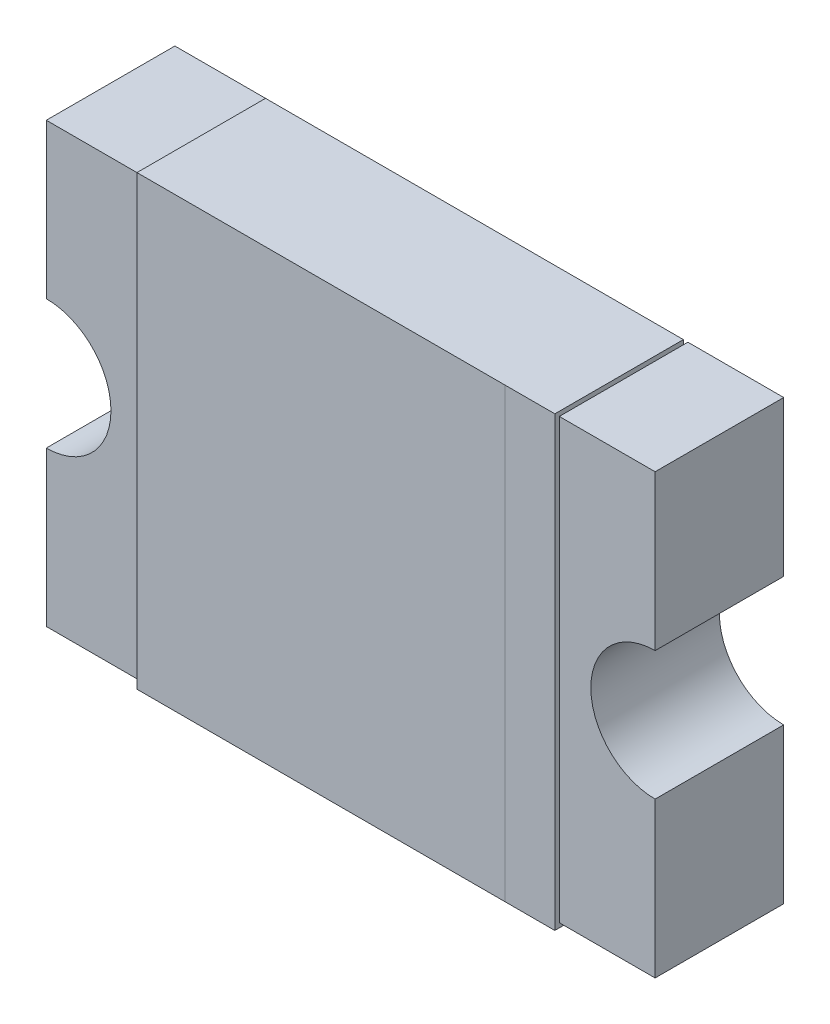
ISO-10303-21;
HEADER;
FILE_DESCRIPTION(('STEP AP214'),'2;1');
FILE_NAME('part.step','',(''),(''),'','','');
FILE_SCHEMA(('AUTOMOTIVE_DESIGN { 1 0 10303 214 1 1 1 1 }'));
ENDSEC;
DATA;
#1=APPLICATION_CONTEXT('core data for automotive mechanical design processes');
#2=APPLICATION_PROTOCOL_DEFINITION('international standard','automotive_design',2000,#1);
#3=PRODUCT_CONTEXT('',#1,'mechanical');
#4=PRODUCT('Part','Part','',(#3));
#5=PRODUCT_RELATED_PRODUCT_CATEGORY('part','',(#4));
#6=PRODUCT_DEFINITION_FORMATION('','',#4);
#7=PRODUCT_DEFINITION_CONTEXT('part definition',#1,'design');
#8=PRODUCT_DEFINITION('design','',#6,#7);
#9=PRODUCT_DEFINITION_SHAPE('','',#8);
#10=(LENGTH_UNIT() NAMED_UNIT(*) SI_UNIT(.MILLI.,.METRE.));
#11=(NAMED_UNIT(*) PLANE_ANGLE_UNIT() SI_UNIT($,.RADIAN.));
#12=(NAMED_UNIT(*) SI_UNIT($,.STERADIAN.) SOLID_ANGLE_UNIT());
#13=UNCERTAINTY_MEASURE_WITH_UNIT(LENGTH_MEASURE(1.E-05),#10,'distance_accuracy_value','');
#14=(GEOMETRIC_REPRESENTATION_CONTEXT(3) GLOBAL_UNCERTAINTY_ASSIGNED_CONTEXT((#13)) GLOBAL_UNIT_ASSIGNED_CONTEXT((#10,
#11,#12)) REPRESENTATION_CONTEXT('',''));
#15=CARTESIAN_POINT('',(0.,0.,0.));
#16=DIRECTION('',(0.,0.,1.));
#17=DIRECTION('',(1.,0.,0.));
#18=AXIS2_PLACEMENT_3D('',#15,#16,#17);
#19=CARTESIAN_POINT('',(1.625,-1.74,1.0349));
#20=DIRECTION('',(0.,0.,-1.));
#21=DIRECTION('',(0.,-1.,0.));
#22=AXIS2_PLACEMENT_3D('',#19,#20,#21);
#23=PLANE('',#22);
#24=DIRECTION('',(0.,1.,0.));
#25=VECTOR('',#24,1.);
#26=CARTESIAN_POINT('',(1.625,1.74,1.0349));
#27=LINE('',#26,#25);
#28=CARTESIAN_POINT('',(1.625,-1.74,1.0349));
#29=VERTEX_POINT('',#28);
#30=CARTESIAN_POINT('',(1.625,1.74,1.0349));
#31=VERTEX_POINT('',#30);
#32=EDGE_CURVE('E238',#29,#31,#27,.T.);
#33=ORIENTED_EDGE('',*,*,#32,.T.);
#34=DIRECTION('',(-1.,0.,0.));
#35=VECTOR('',#34,1.);
#36=CARTESIAN_POINT('',(1.625,1.74,1.0349));
#37=LINE('',#36,#35);
#38=CARTESIAN_POINT('',(1.236867777919,1.74,1.0349));
#39=VERTEX_POINT('',#38);
#40=EDGE_CURVE('E379',#31,#39,#37,.T.);
#41=ORIENTED_EDGE('',*,*,#40,.T.);
#42=DIRECTION('',(0.,-1.,0.));
#43=VECTOR('',#42,1.);
#44=CARTESIAN_POINT('',(1.236867777919,1.74,1.0349));
#45=LINE('',#44,#43);
#46=CARTESIAN_POINT('',(1.236867777919,-1.74,1.0349));
#47=VERTEX_POINT('',#46);
#48=EDGE_CURVE('E11',#39,#47,#45,.T.);
#49=ORIENTED_EDGE('',*,*,#48,.T.);
#50=DIRECTION('',(1.,0.,0.));
#51=VECTOR('',#50,1.);
#52=CARTESIAN_POINT('',(1.625,-1.74,1.0349));
#53=LINE('',#52,#51);
#54=EDGE_CURVE('E235',#47,#29,#53,.T.);
#55=ORIENTED_EDGE('',*,*,#54,.T.);
#56=EDGE_LOOP('',(#33,#41,#49,#55));
#57=FACE_BOUND('',#56,.T.);
#58=ADVANCED_FACE('F18',(#57),#23,.F.);
#59=CARTESIAN_POINT('',(1.236867777919,1.74,1.0349));
#60=DIRECTION('',(-1.,0.,0.));
#61=DIRECTION('',(0.,0.,1.));
#62=AXIS2_PLACEMENT_3D('',#59,#60,#61);
#63=PLANE('',#62);
#64=DIRECTION('',(0.,-1.,0.));
#65=VECTOR('',#64,1.);
#66=CARTESIAN_POINT('',(1.236867777919,1.74,1.035));
#67=LINE('',#66,#65);
#68=CARTESIAN_POINT('',(1.236867777919,1.74,1.035));
#69=VERTEX_POINT('',#68);
#70=CARTESIAN_POINT('',(1.236867777919,-1.74,1.035));
#71=VERTEX_POINT('',#70);
#72=EDGE_CURVE('E224',#69,#71,#67,.T.);
#73=ORIENTED_EDGE('',*,*,#72,.T.);
#74=DIRECTION('',(0.,0.,1.));
#75=VECTOR('',#74,1.);
#76=CARTESIAN_POINT('',(1.236867777919,-1.74,1.0349));
#77=LINE('',#76,#75);
#78=EDGE_CURVE('E252',#47,#71,#77,.T.);
#79=ORIENTED_EDGE('',*,*,#78,.F.);
#80=ORIENTED_EDGE('',*,*,#48,.F.);
#81=DIRECTION('',(0.,0.,1.));
#82=VECTOR('',#81,1.);
#83=CARTESIAN_POINT('',(1.236867777919,1.74,1.0349));
#84=LINE('',#83,#82);
#85=EDGE_CURVE('E375',#39,#69,#84,.T.);
#86=ORIENTED_EDGE('',*,*,#85,.T.);
#87=EDGE_LOOP('',(#73,#79,#80,#86));
#88=FACE_BOUND('',#87,.T.);
#89=ADVANCED_FACE('F549',(#88),#63,.F.);
#90=CARTESIAN_POINT('',(-1.625,1.74,0.035));
#91=DIRECTION('',(0.,0.,-1.));
#92=DIRECTION('',(0.,-1.,0.));
#93=AXIS2_PLACEMENT_3D('',#90,#91,#92);
#94=PLANE('',#93);
#95=DIRECTION('',(0.,1.,0.));
#96=VECTOR('',#95,1.);
#97=CARTESIAN_POINT('',(-1.625,-1.74,0.035));
#98=LINE('',#97,#96);
#99=CARTESIAN_POINT('',(-1.625,-1.74,0.035));
#100=VERTEX_POINT('',#99);
#101=CARTESIAN_POINT('',(-1.625,-1.705,0.035));
#102=VERTEX_POINT('',#101);
#103=EDGE_CURVE('E360',#100,#102,#98,.T.);
#104=ORIENTED_EDGE('',*,*,#103,.T.);
#105=DIRECTION('',(0.,1.,0.));
#106=VECTOR('',#105,1.);
#107=CARTESIAN_POINT('',(-1.625,-1.74,0.035));
#108=LINE('',#107,#106);
#109=CARTESIAN_POINT('',(-1.625,1.705,0.035));
#110=VERTEX_POINT('',#109);
#111=EDGE_CURVE('E221',#102,#110,#108,.T.);
#112=ORIENTED_EDGE('',*,*,#111,.T.);
#113=DIRECTION('',(0.,1.,0.));
#114=VECTOR('',#113,1.);
#115=CARTESIAN_POINT('',(-1.625,-1.74,0.035));
#116=LINE('',#115,#114);
#117=CARTESIAN_POINT('',(-1.625,1.74,0.035));
#118=VERTEX_POINT('',#117);
#119=EDGE_CURVE('E374',#110,#118,#116,.T.);
#120=ORIENTED_EDGE('',*,*,#119,.T.);
#121=DIRECTION('',(1.,0.,0.));
#122=VECTOR('',#121,1.);
#123=CARTESIAN_POINT('',(-1.625,1.74,0.035));
#124=LINE('',#123,#122);
#125=CARTESIAN_POINT('',(1.625,1.74,0.035));
#126=VERTEX_POINT('',#125);
#127=EDGE_CURVE('E367',#118,#126,#124,.T.);
#128=ORIENTED_EDGE('',*,*,#127,.T.);
#129=DIRECTION('',(0.,-1.,0.));
#130=VECTOR('',#129,1.);
#131=CARTESIAN_POINT('',(1.625,-1.74,0.035));
#132=LINE('',#131,#130);
#133=CARTESIAN_POINT('',(1.625,1.705,0.035));
#134=VERTEX_POINT('',#133);
#135=EDGE_CURVE('E335',#126,#134,#132,.T.);
#136=ORIENTED_EDGE('',*,*,#135,.T.);
#137=DIRECTION('',(0.,-1.,0.));
#138=VECTOR('',#137,1.);
#139=CARTESIAN_POINT('',(1.625,-1.74,0.035));
#140=LINE('',#139,#138);
#141=CARTESIAN_POINT('',(1.625,-1.705,0.035));
#142=VERTEX_POINT('',#141);
#143=EDGE_CURVE('E29',#134,#142,#140,.T.);
#144=ORIENTED_EDGE('',*,*,#143,.T.);
#145=DIRECTION('',(0.,-1.,0.));
#146=VECTOR('',#145,1.);
#147=CARTESIAN_POINT('',(1.625,-1.74,0.035));
#148=LINE('',#147,#146);
#149=CARTESIAN_POINT('',(1.625,-1.74,0.035));
#150=VERTEX_POINT('',#149);
#151=EDGE_CURVE('E225',#142,#150,#148,.T.);
#152=ORIENTED_EDGE('',*,*,#151,.T.);
#153=DIRECTION('',(-1.,0.,0.));
#154=VECTOR('',#153,1.);
#155=CARTESIAN_POINT('',(-1.625,-1.74,0.035));
#156=LINE('',#155,#154);
#157=EDGE_CURVE('E251',#150,#100,#156,.T.);
#158=ORIENTED_EDGE('',*,*,#157,.T.);
#159=EDGE_LOOP('',(#104,#112,#120,#128,#136,#144,#152,#158));
#160=FACE_BOUND('',#159,.T.);
#161=ADVANCED_FACE('F446',(#160),#94,.T.);
#162=CARTESIAN_POINT('',(1.625,-1.74,0.035));
#163=DIRECTION('',(1.,0.,0.));
#164=DIRECTION('',(0.,1.,0.));
#165=AXIS2_PLACEMENT_3D('',#162,#163,#164);
#166=PLANE('',#165);
#167=ORIENTED_EDGE('',*,*,#143,.F.);
#168=DIRECTION('',(0.,0.,1.));
#169=VECTOR('',#168,1.);
#170=CARTESIAN_POINT('',(1.625,1.705,1.));
#171=LINE('',#170,#169);
#172=CARTESIAN_POINT('',(1.625,1.705,0.));
#173=VERTEX_POINT('',#172);
#174=EDGE_CURVE('E256',#173,#134,#171,.T.);
#175=ORIENTED_EDGE('',*,*,#174,.F.);
#176=DIRECTION('',(0.,-1.,0.));
#177=VECTOR('',#176,1.);
#178=CARTESIAN_POINT('',(1.625,-1.74,0.));
#179=LINE('',#178,#177);
#180=CARTESIAN_POINT('',(1.625,-1.705,0.));
#181=VERTEX_POINT('',#180);
#182=EDGE_CURVE('E336',#173,#181,#179,.T.);
#183=ORIENTED_EDGE('',*,*,#182,.T.);
#184=DIRECTION('',(0.,0.,1.));
#185=VECTOR('',#184,1.);
#186=CARTESIAN_POINT('',(1.625,-1.705,1.035));
#187=LINE('',#186,#185);
#188=EDGE_CURVE('E380',#181,#142,#187,.T.);
#189=ORIENTED_EDGE('',*,*,#188,.T.);
#190=EDGE_LOOP('',(#167,#175,#183,#189));
#191=FACE_BOUND('',#190,.T.);
#192=ADVANCED_FACE('F559',(#191),#166,.F.);
#193=CARTESIAN_POINT('',(-1.625,-1.74,0.035));
#194=DIRECTION('',(-1.,0.,0.));
#195=DIRECTION('',(0.,0.,1.));
#196=AXIS2_PLACEMENT_3D('',#193,#194,#195);
#197=PLANE('',#196);
#198=DIRECTION('',(0.,1.,0.));
#199=VECTOR('',#198,1.);
#200=CARTESIAN_POINT('',(-1.625,-1.74,0.));
#201=LINE('',#200,#199);
#202=CARTESIAN_POINT('',(-1.625,-1.705,0.));
#203=VERTEX_POINT('',#202);
#204=CARTESIAN_POINT('',(-1.625,1.705,0.));
#205=VERTEX_POINT('',#204);
#206=EDGE_CURVE('E262',#203,#205,#201,.T.);
#207=ORIENTED_EDGE('',*,*,#206,.T.);
#208=DIRECTION('',(0.,0.,1.));
#209=VECTOR('',#208,1.);
#210=CARTESIAN_POINT('',(-1.625,1.705,1.035));
#211=LINE('',#210,#209);
#212=EDGE_CURVE('E359',#205,#110,#211,.T.);
#213=ORIENTED_EDGE('',*,*,#212,.T.);
#214=ORIENTED_EDGE('',*,*,#111,.F.);
#215=DIRECTION('',(0.,0.,1.));
#216=VECTOR('',#215,1.);
#217=CARTESIAN_POINT('',(-1.625,-1.705,1.));
#218=LINE('',#217,#216);
#219=EDGE_CURVE('E288',#203,#102,#218,.T.);
#220=ORIENTED_EDGE('',*,*,#219,.F.);
#221=EDGE_LOOP('',(#207,#213,#214,#220));
#222=FACE_BOUND('',#221,.T.);
#223=ADVANCED_FACE('F557',(#222),#197,.F.);
#224=CARTESIAN_POINT('',(1.625,1.705,1.035));
#225=DIRECTION('',(0.,0.,-1.));
#226=DIRECTION('',(0.,-1.,0.));
#227=AXIS2_PLACEMENT_3D('',#224,#225,#226);
#228=PLANE('',#227);
#229=DIRECTION('',(-1.,0.,0.));
#230=VECTOR('',#229,1.);
#231=CARTESIAN_POINT('',(-1.625,-1.74,1.035));
#232=LINE('',#231,#230);
#233=CARTESIAN_POINT('',(-1.625,-1.74,1.035));
#234=VERTEX_POINT('',#233);
#235=EDGE_CURVE('E248',#71,#234,#232,.T.);
#236=ORIENTED_EDGE('',*,*,#235,.F.);
#237=ORIENTED_EDGE('',*,*,#72,.F.);
#238=DIRECTION('',(1.,0.,0.));
#239=VECTOR('',#238,1.);
#240=CARTESIAN_POINT('',(-1.625,1.74,1.035));
#241=LINE('',#240,#239);
#242=CARTESIAN_POINT('',(-1.625,1.74,1.035));
#243=VERTEX_POINT('',#242);
#244=EDGE_CURVE('E212',#243,#69,#241,.T.);
#245=ORIENTED_EDGE('',*,*,#244,.F.);
#246=DIRECTION('',(0.,-1.,0.));
#247=VECTOR('',#246,1.);
#248=CARTESIAN_POINT('',(-1.625,1.705,1.035));
#249=LINE('',#248,#247);
#250=EDGE_CURVE('E215',#243,#234,#249,.T.);
#251=ORIENTED_EDGE('',*,*,#250,.T.);
#252=EDGE_LOOP('',(#236,#237,#245,#251));
#253=FACE_BOUND('',#252,.T.);
#254=ADVANCED_FACE('F458',(#253),#228,.F.);
#255=CARTESIAN_POINT('',(-2.365,0.,0.));
#256=DIRECTION('',(0.,0.,1.));
#257=DIRECTION('',(1.,0.,0.));
#258=AXIS2_PLACEMENT_3D('',#255,#256,#257);
#259=CYLINDRICAL_SURFACE('',#258,0.502851750544);
#260=DIRECTION('',(0.,0.,1.));
#261=VECTOR('',#260,1.);
#262=CARTESIAN_POINT('',(-1.862148249456,0.,0.));
#263=LINE('',#262,#261);
#264=CARTESIAN_POINT('',(-1.862148249456,0.,0.));
#265=VERTEX_POINT('',#264);
#266=CARTESIAN_POINT('',(-1.862148249456,0.,1.));
#267=VERTEX_POINT('',#266);
#268=EDGE_CURVE('E202',#265,#267,#263,.T.);
#269=ORIENTED_EDGE('',*,*,#268,.F.);
#270=CARTESIAN_POINT('',(-2.365,0.,0.));
#271=DIRECTION('',(0.,0.,1.));
#272=DIRECTION('',(1.,0.,0.));
#273=AXIS2_PLACEMENT_3D('',#270,#271,#272);
#274=CIRCLE('',#273,0.502851750544);
#275=CARTESIAN_POINT('',(-2.365,-0.502851750544,0.));
#276=VERTEX_POINT('',#275);
#277=EDGE_CURVE('E22',#276,#265,#274,.T.);
#278=ORIENTED_EDGE('',*,*,#277,.F.);
#279=DIRECTION('',(0.,0.,-1.));
#280=VECTOR('',#279,1.);
#281=CARTESIAN_POINT('',(-2.365,-0.502851750544,0.));
#282=LINE('',#281,#280);
#283=CARTESIAN_POINT('',(-2.365,-0.502851750544,1.));
#284=VERTEX_POINT('',#283);
#285=EDGE_CURVE('E43',#284,#276,#282,.T.);
#286=ORIENTED_EDGE('',*,*,#285,.F.);
#287=CARTESIAN_POINT('',(-2.365,0.,1.));
#288=DIRECTION('',(0.,0.,1.));
#289=DIRECTION('',(1.,0.,0.));
#290=AXIS2_PLACEMENT_3D('',#287,#288,#289);
#291=CIRCLE('',#290,0.502851750544);
#292=EDGE_CURVE('E281',#284,#267,#291,.T.);
#293=ORIENTED_EDGE('',*,*,#292,.T.);
#294=EDGE_LOOP('',(#269,#278,#286,#293));
#295=FACE_BOUND('',#294,.T.);
#296=ADVANCED_FACE('F20',(#295),#259,.F.);
#297=CARTESIAN_POINT('',(2.37,0.,0.));
#298=DIRECTION('',(0.,0.,1.));
#299=DIRECTION('',(0.,-1.,0.));
#300=AXIS2_PLACEMENT_3D('',#297,#298,#299);
#301=CYLINDRICAL_SURFACE('',#300,0.5);
#302=DIRECTION('',(0.,0.,-1.));
#303=VECTOR('',#302,1.);
#304=CARTESIAN_POINT('',(2.37,-0.5,0.));
#305=LINE('',#304,#303);
#306=CARTESIAN_POINT('',(2.37,-0.5,1.));
#307=VERTEX_POINT('',#306);
#308=CARTESIAN_POINT('',(2.37,-0.5,0.));
#309=VERTEX_POINT('',#308);
#310=EDGE_CURVE('E186',#307,#309,#305,.T.);
#311=ORIENTED_EDGE('',*,*,#310,.T.);
#312=CARTESIAN_POINT('',(2.37,0.,0.));
#313=DIRECTION('',(0.,0.,-1.));
#314=DIRECTION('',(1.,0.,0.));
#315=AXIS2_PLACEMENT_3D('',#312,#313,#314);
#316=CIRCLE('',#315,0.5);
#317=CARTESIAN_POINT('',(2.37,0.5,0.));
#318=VERTEX_POINT('',#317);
#319=EDGE_CURVE('E275',#309,#318,#316,.T.);
#320=ORIENTED_EDGE('',*,*,#319,.T.);
#321=DIRECTION('',(0.,0.,1.));
#322=VECTOR('',#321,1.);
#323=CARTESIAN_POINT('',(2.37,0.5,0.));
#324=LINE('',#323,#322);
#325=CARTESIAN_POINT('',(2.37,0.5,1.));
#326=VERTEX_POINT('',#325);
#327=EDGE_CURVE('E303',#318,#326,#324,.T.);
#328=ORIENTED_EDGE('',*,*,#327,.T.);
#329=CARTESIAN_POINT('',(2.37,0.,1.));
#330=DIRECTION('',(0.,0.,-1.));
#331=DIRECTION('',(0.,1.,0.));
#332=AXIS2_PLACEMENT_3D('',#329,#330,#331);
#333=CIRCLE('',#332,0.5);
#334=EDGE_CURVE('E300',#307,#326,#333,.T.);
#335=ORIENTED_EDGE('',*,*,#334,.F.);
#336=EDGE_LOOP('',(#311,#320,#328,#335));
#337=FACE_BOUND('',#336,.T.);
#338=ADVANCED_FACE('F581',(#337),#301,.F.);
#339=CARTESIAN_POINT('',(-2.365,1.705,1.));
#340=DIRECTION('',(1.,0.,0.));
#341=DIRECTION('',(0.,1.,0.));
#342=AXIS2_PLACEMENT_3D('',#339,#340,#341);
#343=PLANE('',#342);
#344=DIRECTION('',(0.,-1.,0.));
#345=VECTOR('',#344,1.);
#346=CARTESIAN_POINT('',(-2.365,1.705,1.));
#347=LINE('',#346,#345);
#348=CARTESIAN_POINT('',(-2.365,-1.705,1.));
#349=VERTEX_POINT('',#348);
#350=EDGE_CURVE('E284',#284,#349,#347,.T.);
#351=ORIENTED_EDGE('',*,*,#350,.F.);
#352=ORIENTED_EDGE('',*,*,#285,.T.);
#353=DIRECTION('',(0.,-1.,0.));
#354=VECTOR('',#353,1.);
#355=CARTESIAN_POINT('',(-2.365,1.705,0.));
#356=LINE('',#355,#354);
#357=CARTESIAN_POINT('',(-2.365,-1.705,0.));
#358=VERTEX_POINT('',#357);
#359=EDGE_CURVE('E243',#276,#358,#356,.T.);
#360=ORIENTED_EDGE('',*,*,#359,.T.);
#361=DIRECTION('',(0.,0.,-1.));
#362=VECTOR('',#361,1.);
#363=CARTESIAN_POINT('',(-2.365,-1.705,1.));
#364=LINE('',#363,#362);
#365=EDGE_CURVE('E234',#349,#358,#364,.T.);
#366=ORIENTED_EDGE('',*,*,#365,.F.);
#367=EDGE_LOOP('',(#351,#352,#360,#366));
#368=FACE_BOUND('',#367,.T.);
#369=ADVANCED_FACE('F575',(#368),#343,.F.);
#370=CARTESIAN_POINT('',(-2.365,-1.705,0.));
#371=DIRECTION('',(0.,0.,1.));
#372=DIRECTION('',(1.,0.,0.));
#373=AXIS2_PLACEMENT_3D('',#370,#371,#372);
#374=PLANE('',#373);
#375=DIRECTION('',(1.,0.,0.));
#376=VECTOR('',#375,1.);
#377=CARTESIAN_POINT('',(-2.365,-1.705,0.));
#378=LINE('',#377,#376);
#379=CARTESIAN_POINT('',(2.37,-1.705,0.));
#380=VERTEX_POINT('',#379);
#381=EDGE_CURVE('E311',#181,#380,#378,.T.);
#382=ORIENTED_EDGE('',*,*,#381,.F.);
#383=ORIENTED_EDGE('',*,*,#182,.F.);
#384=DIRECTION('',(-1.,0.,0.));
#385=VECTOR('',#384,1.);
#386=CARTESIAN_POINT('',(-2.365,1.705,0.));
#387=LINE('',#386,#385);
#388=CARTESIAN_POINT('',(2.37,1.705,0.));
#389=VERTEX_POINT('',#388);
#390=EDGE_CURVE('E261',#389,#173,#387,.T.);
#391=ORIENTED_EDGE('',*,*,#390,.F.);
#392=DIRECTION('',(0.,1.,0.));
#393=VECTOR('',#392,1.);
#394=CARTESIAN_POINT('',(2.37,1.705,0.));
#395=LINE('',#394,#393);
#396=EDGE_CURVE('E285',#318,#389,#395,.T.);
#397=ORIENTED_EDGE('',*,*,#396,.F.);
#398=ORIENTED_EDGE('',*,*,#319,.F.);
#399=DIRECTION('',(0.,1.,0.));
#400=VECTOR('',#399,1.);
#401=CARTESIAN_POINT('',(2.37,1.705,0.));
#402=LINE('',#401,#400);
#403=EDGE_CURVE('E344',#380,#309,#402,.T.);
#404=ORIENTED_EDGE('',*,*,#403,.F.);
#405=EDGE_LOOP('',(#382,#383,#391,#397,#398,#404));
#406=FACE_BOUND('',#405,.T.);
#407=ADVANCED_FACE('F590',(#406),#374,.F.);
#408=CARTESIAN_POINT('',(-2.365,-1.705,1.));
#409=DIRECTION('',(0.,0.,1.));
#410=DIRECTION('',(1.,0.,0.));
#411=AXIS2_PLACEMENT_3D('',#408,#409,#410);
#412=PLANE('',#411);
#413=DIRECTION('',(0.,-1.,0.));
#414=VECTOR('',#413,1.);
#415=CARTESIAN_POINT('',(-1.625,1.705,1.));
#416=LINE('',#415,#414);
#417=CARTESIAN_POINT('',(-1.625,1.705,1.));
#418=VERTEX_POINT('',#417);
#419=CARTESIAN_POINT('',(-1.625,-1.705,1.));
#420=VERTEX_POINT('',#419);
#421=EDGE_CURVE('E343',#418,#420,#416,.T.);
#422=ORIENTED_EDGE('',*,*,#421,.F.);
#423=DIRECTION('',(-1.,0.,0.));
#424=VECTOR('',#423,1.);
#425=CARTESIAN_POINT('',(-2.365,1.705,1.));
#426=LINE('',#425,#424);
#427=CARTESIAN_POINT('',(-2.365,1.705,1.));
#428=VERTEX_POINT('',#427);
#429=EDGE_CURVE('E182',#418,#428,#426,.T.);
#430=ORIENTED_EDGE('',*,*,#429,.T.);
#431=DIRECTION('',(0.,-1.,0.));
#432=VECTOR('',#431,1.);
#433=CARTESIAN_POINT('',(-2.365,1.705,1.));
#434=LINE('',#433,#432);
#435=CARTESIAN_POINT('',(-2.365,0.502851750544,1.));
#436=VERTEX_POINT('',#435);
#437=EDGE_CURVE('E173',#428,#436,#434,.T.);
#438=ORIENTED_EDGE('',*,*,#437,.T.);
#439=CARTESIAN_POINT('',(-2.365,0.,1.));
#440=DIRECTION('',(0.,0.,1.));
#441=DIRECTION('',(1.,0.,0.));
#442=AXIS2_PLACEMENT_3D('',#439,#440,#441);
#443=CIRCLE('',#442,0.502851750544);
#444=EDGE_CURVE('E179',#267,#436,#443,.T.);
#445=ORIENTED_EDGE('',*,*,#444,.F.);
#446=ORIENTED_EDGE('',*,*,#292,.F.);
#447=ORIENTED_EDGE('',*,*,#350,.T.);
#448=DIRECTION('',(1.,0.,0.));
#449=VECTOR('',#448,1.);
#450=CARTESIAN_POINT('',(-2.365,-1.705,1.));
#451=LINE('',#450,#449);
#452=EDGE_CURVE('E231',#349,#420,#451,.T.);
#453=ORIENTED_EDGE('',*,*,#452,.T.);
#454=EDGE_LOOP('',(#422,#430,#438,#445,#446,#447,#453));
#455=FACE_BOUND('',#454,.T.);
#456=ADVANCED_FACE('F176',(#455),#412,.T.);
#457=CARTESIAN_POINT('',(2.37,1.705,1.));
#458=DIRECTION('',(-1.,0.,0.));
#459=DIRECTION('',(0.,1.,0.));
#460=AXIS2_PLACEMENT_3D('',#457,#458,#459);
#461=PLANE('',#460);
#462=ORIENTED_EDGE('',*,*,#327,.F.);
#463=ORIENTED_EDGE('',*,*,#396,.T.);
#464=DIRECTION('',(0.,0.,-1.));
#465=VECTOR('',#464,1.);
#466=CARTESIAN_POINT('',(2.37,1.705,1.));
#467=LINE('',#466,#465);
#468=CARTESIAN_POINT('',(2.37,1.705,1.));
#469=VERTEX_POINT('',#468);
#470=EDGE_CURVE('E293',#469,#389,#467,.T.);
#471=ORIENTED_EDGE('',*,*,#470,.F.);
#472=DIRECTION('',(0.,1.,0.));
#473=VECTOR('',#472,1.);
#474=CARTESIAN_POINT('',(2.37,1.705,1.));
#475=LINE('',#474,#473);
#476=EDGE_CURVE('E187',#326,#469,#475,.T.);
#477=ORIENTED_EDGE('',*,*,#476,.F.);
#478=EDGE_LOOP('',(#462,#463,#471,#477));
#479=FACE_BOUND('',#478,.T.);
#480=ADVANCED_FACE('F598',(#479),#461,.F.);
#481=CARTESIAN_POINT('',(2.37,1.705,1.));
#482=DIRECTION('',(-1.,0.,0.));
#483=DIRECTION('',(0.,1.,0.));
#484=AXIS2_PLACEMENT_3D('',#481,#482,#483);
#485=PLANE('',#484);
#486=ORIENTED_EDGE('',*,*,#310,.F.);
#487=DIRECTION('',(0.,1.,0.));
#488=VECTOR('',#487,1.);
#489=CARTESIAN_POINT('',(2.37,1.705,1.));
#490=LINE('',#489,#488);
#491=CARTESIAN_POINT('',(2.37,-1.705,1.));
#492=VERTEX_POINT('',#491);
#493=EDGE_CURVE('E260',#492,#307,#490,.T.);
#494=ORIENTED_EDGE('',*,*,#493,.F.);
#495=DIRECTION('',(0.,0.,-1.));
#496=VECTOR('',#495,1.);
#497=CARTESIAN_POINT('',(2.37,-1.705,1.));
#498=LINE('',#497,#496);
#499=EDGE_CURVE('E306',#492,#380,#498,.T.);
#500=ORIENTED_EDGE('',*,*,#499,.T.);
#501=ORIENTED_EDGE('',*,*,#403,.T.);
#502=EDGE_LOOP('',(#486,#494,#500,#501));
#503=FACE_BOUND('',#502,.T.);
#504=ADVANCED_FACE('F544',(#503),#485,.F.);
#505=CARTESIAN_POINT('',(-2.365,1.705,1.));
#506=DIRECTION('',(1.,0.,0.));
#507=DIRECTION('',(0.,1.,0.));
#508=AXIS2_PLACEMENT_3D('',#505,#506,#507);
#509=PLANE('',#508);
#510=DIRECTION('',(0.,-1.,0.));
#511=VECTOR('',#510,1.);
#512=CARTESIAN_POINT('',(-2.365,1.705,0.));
#513=LINE('',#512,#511);
#514=CARTESIAN_POINT('',(-2.365,1.705,0.));
#515=VERTEX_POINT('',#514);
#516=CARTESIAN_POINT('',(-2.365,0.502851750544,0.));
#517=VERTEX_POINT('',#516);
#518=EDGE_CURVE('E193',#515,#517,#513,.T.);
#519=ORIENTED_EDGE('',*,*,#518,.T.);
#520=DIRECTION('',(0.,0.,1.));
#521=VECTOR('',#520,1.);
#522=CARTESIAN_POINT('',(-2.365,0.502851750544,0.));
#523=LINE('',#522,#521);
#524=EDGE_CURVE('E190',#517,#436,#523,.T.);
#525=ORIENTED_EDGE('',*,*,#524,.T.);
#526=ORIENTED_EDGE('',*,*,#437,.F.);
#527=DIRECTION('',(0.,0.,-1.));
#528=VECTOR('',#527,1.);
#529=CARTESIAN_POINT('',(-2.365,1.705,1.));
#530=LINE('',#529,#528);
#531=EDGE_CURVE('E272',#428,#515,#530,.T.);
#532=ORIENTED_EDGE('',*,*,#531,.T.);
#533=EDGE_LOOP('',(#519,#525,#526,#532));
#534=FACE_BOUND('',#533,.T.);
#535=ADVANCED_FACE('F191',(#534),#509,.F.);
#536=CARTESIAN_POINT('',(-2.365,-1.705,1.));
#537=DIRECTION('',(0.,0.,1.));
#538=DIRECTION('',(1.,0.,0.));
#539=AXIS2_PLACEMENT_3D('',#536,#537,#538);
#540=PLANE('',#539);
#541=DIRECTION('',(0.,1.,0.));
#542=VECTOR('',#541,1.);
#543=CARTESIAN_POINT('',(1.625,1.705,1.));
#544=LINE('',#543,#542);
#545=CARTESIAN_POINT('',(1.625,-1.705,1.));
#546=VERTEX_POINT('',#545);
#547=CARTESIAN_POINT('',(1.625,1.705,1.));
#548=VERTEX_POINT('',#547);
#549=EDGE_CURVE('E276',#546,#548,#544,.T.);
#550=ORIENTED_EDGE('',*,*,#549,.F.);
#551=DIRECTION('',(1.,0.,0.));
#552=VECTOR('',#551,1.);
#553=CARTESIAN_POINT('',(-2.365,-1.705,1.));
#554=LINE('',#553,#552);
#555=EDGE_CURVE('E310',#546,#492,#554,.T.);
#556=ORIENTED_EDGE('',*,*,#555,.T.);
#557=ORIENTED_EDGE('',*,*,#493,.T.);
#558=ORIENTED_EDGE('',*,*,#334,.T.);
#559=ORIENTED_EDGE('',*,*,#476,.T.);
#560=DIRECTION('',(-1.,0.,0.));
#561=VECTOR('',#560,1.);
#562=CARTESIAN_POINT('',(-2.365,1.705,1.));
#563=LINE('',#562,#561);
#564=EDGE_CURVE('E271',#469,#548,#563,.T.);
#565=ORIENTED_EDGE('',*,*,#564,.T.);
#566=EDGE_LOOP('',(#550,#556,#557,#558,#559,#565));
#567=FACE_BOUND('',#566,.T.);
#568=ADVANCED_FACE('F534',(#567),#540,.T.);
#569=CARTESIAN_POINT('',(-2.365,1.705,1.));
#570=DIRECTION('',(0.,-1.,0.));
#571=DIRECTION('',(0.,0.,-1.));
#572=AXIS2_PLACEMENT_3D('',#569,#570,#571);
#573=PLANE('',#572);
#574=DIRECTION('',(0.,0.,-1.));
#575=VECTOR('',#574,1.);
#576=CARTESIAN_POINT('',(1.625,1.705,1.035));
#577=LINE('',#576,#575);
#578=EDGE_CURVE('E280',#548,#134,#577,.T.);
#579=ORIENTED_EDGE('',*,*,#578,.F.);
#580=ORIENTED_EDGE('',*,*,#564,.F.);
#581=ORIENTED_EDGE('',*,*,#470,.T.);
#582=ORIENTED_EDGE('',*,*,#390,.T.);
#583=ORIENTED_EDGE('',*,*,#174,.T.);
#584=EDGE_LOOP('',(#579,#580,#581,#582,#583));
#585=FACE_BOUND('',#584,.T.);
#586=ADVANCED_FACE('F475',(#585),#573,.F.);
#587=CARTESIAN_POINT('',(-2.365,1.705,1.));
#588=DIRECTION('',(0.,-1.,0.));
#589=DIRECTION('',(0.,0.,-1.));
#590=AXIS2_PLACEMENT_3D('',#587,#588,#589);
#591=PLANE('',#590);
#592=ORIENTED_EDGE('',*,*,#212,.F.);
#593=DIRECTION('',(-1.,0.,0.));
#594=VECTOR('',#593,1.);
#595=CARTESIAN_POINT('',(-2.365,1.705,0.));
#596=LINE('',#595,#594);
#597=EDGE_CURVE('E198',#205,#515,#596,.T.);
#598=ORIENTED_EDGE('',*,*,#597,.T.);
#599=ORIENTED_EDGE('',*,*,#531,.F.);
#600=ORIENTED_EDGE('',*,*,#429,.F.);
#601=DIRECTION('',(0.,0.,1.));
#602=VECTOR('',#601,1.);
#603=CARTESIAN_POINT('',(-1.625,1.705,1.035));
#604=LINE('',#603,#602);
#605=EDGE_CURVE('E355',#110,#418,#604,.T.);
#606=ORIENTED_EDGE('',*,*,#605,.F.);
#607=EDGE_LOOP('',(#592,#598,#599,#600,#606));
#608=FACE_BOUND('',#607,.T.);
#609=ADVANCED_FACE('F542',(#608),#591,.F.);
#610=CARTESIAN_POINT('',(-2.365,-1.705,1.));
#611=DIRECTION('',(0.,1.,0.));
#612=DIRECTION('',(1.,0.,0.));
#613=AXIS2_PLACEMENT_3D('',#610,#611,#612);
#614=PLANE('',#613);
#615=ORIENTED_EDGE('',*,*,#188,.F.);
#616=ORIENTED_EDGE('',*,*,#381,.T.);
#617=ORIENTED_EDGE('',*,*,#499,.F.);
#618=ORIENTED_EDGE('',*,*,#555,.F.);
#619=DIRECTION('',(0.,0.,1.));
#620=VECTOR('',#619,1.);
#621=CARTESIAN_POINT('',(1.625,-1.705,1.035));
#622=LINE('',#621,#620);
#623=EDGE_CURVE('E229',#142,#546,#622,.T.);
#624=ORIENTED_EDGE('',*,*,#623,.F.);
#625=EDGE_LOOP('',(#615,#616,#617,#618,#624));
#626=FACE_BOUND('',#625,.T.);
#627=ADVANCED_FACE('F532',(#626),#614,.F.);
#628=CARTESIAN_POINT('',(-2.365,-1.705,1.));
#629=DIRECTION('',(0.,1.,0.));
#630=DIRECTION('',(1.,0.,0.));
#631=AXIS2_PLACEMENT_3D('',#628,#629,#630);
#632=PLANE('',#631);
#633=DIRECTION('',(0.,0.,-1.));
#634=VECTOR('',#633,1.);
#635=CARTESIAN_POINT('',(-1.625,-1.705,1.035));
#636=LINE('',#635,#634);
#637=EDGE_CURVE('E339',#420,#102,#636,.T.);
#638=ORIENTED_EDGE('',*,*,#637,.F.);
#639=ORIENTED_EDGE('',*,*,#452,.F.);
#640=ORIENTED_EDGE('',*,*,#365,.T.);
#641=DIRECTION('',(1.,0.,0.));
#642=VECTOR('',#641,1.);
#643=CARTESIAN_POINT('',(-2.365,-1.705,0.));
#644=LINE('',#643,#642);
#645=EDGE_CURVE('E247',#358,#203,#644,.T.);
#646=ORIENTED_EDGE('',*,*,#645,.T.);
#647=ORIENTED_EDGE('',*,*,#219,.T.);
#648=EDGE_LOOP('',(#638,#639,#640,#646,#647));
#649=FACE_BOUND('',#648,.T.);
#650=ADVANCED_FACE('F438',(#649),#632,.F.);
#651=CARTESIAN_POINT('',(-1.625,-1.74,0.));
#652=DIRECTION('',(0.,-1.,0.));
#653=DIRECTION('',(0.,0.,-1.));
#654=AXIS2_PLACEMENT_3D('',#651,#652,#653);
#655=PLANE('',#654);
#656=ORIENTED_EDGE('',*,*,#78,.T.);
#657=ORIENTED_EDGE('',*,*,#235,.T.);
#658=DIRECTION('',(0.,0.,-1.));
#659=VECTOR('',#658,1.);
#660=CARTESIAN_POINT('',(-1.625,-1.74,1.035));
#661=LINE('',#660,#659);
#662=EDGE_CURVE('E220',#234,#100,#661,.T.);
#663=ORIENTED_EDGE('',*,*,#662,.T.);
#664=ORIENTED_EDGE('',*,*,#157,.F.);
#665=DIRECTION('',(0.,0.,1.));
#666=VECTOR('',#665,1.);
#667=CARTESIAN_POINT('',(1.625,-1.74,1.035));
#668=LINE('',#667,#666);
#669=EDGE_CURVE('E230',#150,#29,#668,.T.);
#670=ORIENTED_EDGE('',*,*,#669,.T.);
#671=ORIENTED_EDGE('',*,*,#54,.F.);
#672=EDGE_LOOP('',(#656,#657,#663,#664,#670,#671));
#673=FACE_BOUND('',#672,.T.);
#674=ADVANCED_FACE('F451',(#673),#655,.T.);
#675=CARTESIAN_POINT('',(-1.625,1.74,0.));
#676=DIRECTION('',(0.,-1.,0.));
#677=DIRECTION('',(0.,0.,-1.));
#678=AXIS2_PLACEMENT_3D('',#675,#676,#677);
#679=PLANE('',#678);
#680=ORIENTED_EDGE('',*,*,#244,.T.);
#681=ORIENTED_EDGE('',*,*,#85,.F.);
#682=ORIENTED_EDGE('',*,*,#40,.F.);
#683=DIRECTION('',(0.,0.,-1.));
#684=VECTOR('',#683,1.);
#685=CARTESIAN_POINT('',(1.625,1.74,1.035));
#686=LINE('',#685,#684);
#687=EDGE_CURVE('E242',#31,#126,#686,.T.);
#688=ORIENTED_EDGE('',*,*,#687,.T.);
#689=ORIENTED_EDGE('',*,*,#127,.F.);
#690=DIRECTION('',(0.,0.,1.));
#691=VECTOR('',#690,1.);
#692=CARTESIAN_POINT('',(-1.625,1.74,1.035));
#693=LINE('',#692,#691);
#694=EDGE_CURVE('E219',#118,#243,#693,.T.);
#695=ORIENTED_EDGE('',*,*,#694,.T.);
#696=EDGE_LOOP('',(#680,#681,#682,#688,#689,#695));
#697=FACE_BOUND('',#696,.T.);
#698=ADVANCED_FACE('F464',(#697),#679,.F.);
#699=CARTESIAN_POINT('',(-1.625,1.705,1.035));
#700=DIRECTION('',(1.,0.,0.));
#701=DIRECTION('',(0.,1.,0.));
#702=AXIS2_PLACEMENT_3D('',#699,#700,#701);
#703=PLANE('',#702);
#704=ORIENTED_EDGE('',*,*,#103,.F.);
#705=ORIENTED_EDGE('',*,*,#662,.F.);
#706=ORIENTED_EDGE('',*,*,#250,.F.);
#707=ORIENTED_EDGE('',*,*,#694,.F.);
#708=ORIENTED_EDGE('',*,*,#119,.F.);
#709=ORIENTED_EDGE('',*,*,#605,.T.);
#710=ORIENTED_EDGE('',*,*,#421,.T.);
#711=ORIENTED_EDGE('',*,*,#637,.T.);
#712=EDGE_LOOP('',(#704,#705,#706,#707,#708,#709,#710,#711));
#713=FACE_BOUND('',#712,.T.);
#714=ADVANCED_FACE('F444',(#713),#703,.F.);
#715=CARTESIAN_POINT('',(1.625,1.705,1.035));
#716=DIRECTION('',(-1.,0.,0.));
#717=DIRECTION('',(0.,1.,0.));
#718=AXIS2_PLACEMENT_3D('',#715,#716,#717);
#719=PLANE('',#718);
#720=ORIENTED_EDGE('',*,*,#687,.F.);
#721=ORIENTED_EDGE('',*,*,#32,.F.);
#722=ORIENTED_EDGE('',*,*,#669,.F.);
#723=ORIENTED_EDGE('',*,*,#151,.F.);
#724=ORIENTED_EDGE('',*,*,#623,.T.);
#725=ORIENTED_EDGE('',*,*,#549,.T.);
#726=ORIENTED_EDGE('',*,*,#578,.T.);
#727=ORIENTED_EDGE('',*,*,#135,.F.);
#728=EDGE_LOOP('',(#720,#721,#722,#723,#724,#725,#726,#727));
#729=FACE_BOUND('',#728,.T.);
#730=ADVANCED_FACE('F469',(#729),#719,.F.);
#731=CARTESIAN_POINT('',(-2.365,-1.705,0.));
#732=DIRECTION('',(0.,0.,1.));
#733=DIRECTION('',(1.,0.,0.));
#734=AXIS2_PLACEMENT_3D('',#731,#732,#733);
#735=PLANE('',#734);
#736=ORIENTED_EDGE('',*,*,#597,.F.);
#737=ORIENTED_EDGE('',*,*,#206,.F.);
#738=ORIENTED_EDGE('',*,*,#645,.F.);
#739=ORIENTED_EDGE('',*,*,#359,.F.);
#740=ORIENTED_EDGE('',*,*,#277,.T.);
#741=CARTESIAN_POINT('',(-2.365,0.,0.));
#742=DIRECTION('',(0.,0.,1.));
#743=DIRECTION('',(1.,0.,0.));
#744=AXIS2_PLACEMENT_3D('',#741,#742,#743);
#745=CIRCLE('',#744,0.502851750544);
#746=EDGE_CURVE('E209',#265,#517,#745,.T.);
#747=ORIENTED_EDGE('',*,*,#746,.T.);
#748=ORIENTED_EDGE('',*,*,#518,.F.);
#749=EDGE_LOOP('',(#736,#737,#738,#739,#740,#747,#748));
#750=FACE_BOUND('',#749,.T.);
#751=ADVANCED_FACE('F568',(#750),#735,.F.);
#752=CARTESIAN_POINT('',(-2.365,0.,0.));
#753=DIRECTION('',(0.,0.,1.));
#754=DIRECTION('',(1.,0.,0.));
#755=AXIS2_PLACEMENT_3D('',#752,#753,#754);
#756=CYLINDRICAL_SURFACE('',#755,0.502851750544);
#757=ORIENTED_EDGE('',*,*,#746,.F.);
#758=ORIENTED_EDGE('',*,*,#268,.T.);
#759=ORIENTED_EDGE('',*,*,#444,.T.);
#760=ORIENTED_EDGE('',*,*,#524,.F.);
#761=EDGE_LOOP('',(#757,#758,#759,#760));
#762=FACE_BOUND('',#761,.T.);
#763=ADVANCED_FACE('F200',(#762),#756,.F.);
#764=CLOSED_SHELL('',(#58,#89,#161,#192,#223,#254,#296,#338,#369,#407,#456,#480,#504,#535,#568,
#586,#609,#627,#650,#674,#698,#714,#730,#751,#763));
#765=MANIFOLD_SOLID_BREP('B1',#764);
#766=ADVANCED_BREP_SHAPE_REPRESENTATION('',(#18,#765),#14);
#767=SHAPE_DEFINITION_REPRESENTATION(#9,#766);
ENDSEC;
END-ISO-10303-21;
